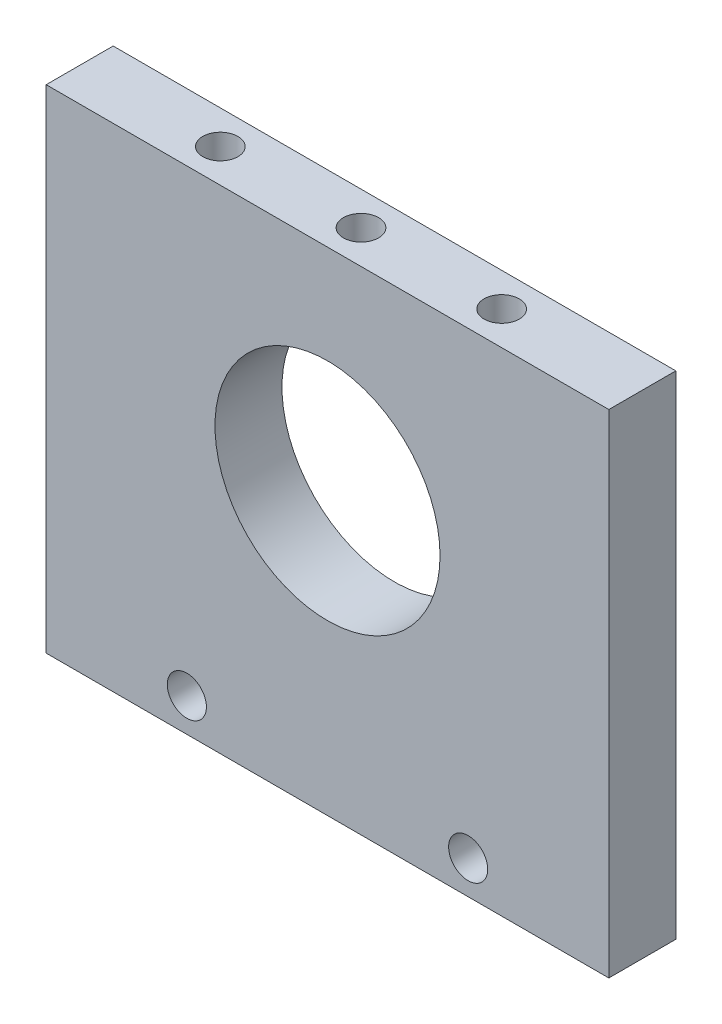
ISO-10303-21;
HEADER;
FILE_DESCRIPTION(('STEP AP214'),'2;1');
FILE_NAME('part.step','',(''),(''),'','','');
FILE_SCHEMA(('AUTOMOTIVE_DESIGN { 1 0 10303 214 1 1 1 1 }'));
ENDSEC;
DATA;
#1=APPLICATION_CONTEXT('core data for automotive mechanical design processes');
#2=APPLICATION_PROTOCOL_DEFINITION('international standard','automotive_design',2000,#1);
#3=PRODUCT_CONTEXT('',#1,'mechanical');
#4=PRODUCT('Part','Part','',(#3));
#5=PRODUCT_RELATED_PRODUCT_CATEGORY('part','',(#4));
#6=PRODUCT_DEFINITION_FORMATION('','',#4);
#7=PRODUCT_DEFINITION_CONTEXT('part definition',#1,'design');
#8=PRODUCT_DEFINITION('design','',#6,#7);
#9=PRODUCT_DEFINITION_SHAPE('','',#8);
#10=(LENGTH_UNIT() NAMED_UNIT(*) SI_UNIT(.MILLI.,.METRE.));
#11=(NAMED_UNIT(*) PLANE_ANGLE_UNIT() SI_UNIT($,.RADIAN.));
#12=(NAMED_UNIT(*) SI_UNIT($,.STERADIAN.) SOLID_ANGLE_UNIT());
#13=UNCERTAINTY_MEASURE_WITH_UNIT(LENGTH_MEASURE(1.E-05),#10,'distance_accuracy_value','');
#14=(GEOMETRIC_REPRESENTATION_CONTEXT(3) GLOBAL_UNCERTAINTY_ASSIGNED_CONTEXT((#13)) GLOBAL_UNIT_ASSIGNED_CONTEXT((#10,
#11,#12)) REPRESENTATION_CONTEXT('',''));
#15=CARTESIAN_POINT('',(0.,0.,0.));
#16=DIRECTION('',(0.,0.,1.));
#17=DIRECTION('',(1.,0.,0.));
#18=AXIS2_PLACEMENT_3D('',#15,#16,#17);
#19=CARTESIAN_POINT('',(-40.,35.,9.525));
#20=DIRECTION('',(1.,0.,0.));
#21=DIRECTION('',(0.,1.,0.));
#22=AXIS2_PLACEMENT_3D('',#19,#20,#21);
#23=PLANE('',#22);
#24=DIRECTION('',(0.,-1.,0.));
#25=VECTOR('',#24,1.);
#26=CARTESIAN_POINT('',(-40.,35.,0.));
#27=LINE('',#26,#25);
#28=CARTESIAN_POINT('',(-40.,35.,0.));
#29=VERTEX_POINT('',#28);
#30=CARTESIAN_POINT('',(-40.0000000000001,-35.,0.));
#31=VERTEX_POINT('',#30);
#32=EDGE_CURVE('E102',#29,#31,#27,.T.);
#33=ORIENTED_EDGE('',*,*,#32,.T.);
#34=DIRECTION('',(0.,0.,-1.));
#35=VECTOR('',#34,1.);
#36=CARTESIAN_POINT('',(-40.0000000000001,-35.,9.525));
#37=LINE('',#36,#35);
#38=CARTESIAN_POINT('',(-40.0000000000001,-35.,9.525));
#39=VERTEX_POINT('',#38);
#40=EDGE_CURVE('E11',#39,#31,#37,.T.);
#41=ORIENTED_EDGE('',*,*,#40,.F.);
#42=DIRECTION('',(0.,-1.,0.));
#43=VECTOR('',#42,1.);
#44=CARTESIAN_POINT('',(-40.,35.,9.525));
#45=LINE('',#44,#43);
#46=CARTESIAN_POINT('',(-40.,35.,9.525));
#47=VERTEX_POINT('',#46);
#48=EDGE_CURVE('E89',#47,#39,#45,.T.);
#49=ORIENTED_EDGE('',*,*,#48,.F.);
#50=DIRECTION('',(0.,0.,-1.));
#51=VECTOR('',#50,1.);
#52=CARTESIAN_POINT('',(-40.,35.,9.525));
#53=LINE('',#52,#51);
#54=EDGE_CURVE('E98',#47,#29,#53,.T.);
#55=ORIENTED_EDGE('',*,*,#54,.T.);
#56=EDGE_LOOP('',(#33,#41,#49,#55));
#57=FACE_BOUND('',#56,.T.);
#58=ADVANCED_FACE('F32',(#57),#23,.F.);
#59=CARTESIAN_POINT('',(-40.0000000000001,-35.,9.525));
#60=DIRECTION('',(0.,1.,0.));
#61=DIRECTION('',(-1.,0.,0.));
#62=AXIS2_PLACEMENT_3D('',#59,#60,#61);
#63=PLANE('',#62);
#64=DIRECTION('',(1.,0.,0.));
#65=VECTOR('',#64,1.);
#66=CARTESIAN_POINT('',(-40.0000000000001,-35.,0.));
#67=LINE('',#66,#65);
#68=CARTESIAN_POINT('',(40.,-35.,0.));
#69=VERTEX_POINT('',#68);
#70=EDGE_CURVE('E93',#31,#69,#67,.T.);
#71=ORIENTED_EDGE('',*,*,#70,.T.);
#72=DIRECTION('',(0.,0.,-1.));
#73=VECTOR('',#72,1.);
#74=CARTESIAN_POINT('',(40.,-35.,9.525));
#75=LINE('',#74,#73);
#76=CARTESIAN_POINT('',(40.,-35.,9.525));
#77=VERTEX_POINT('',#76);
#78=EDGE_CURVE('E45',#77,#69,#75,.T.);
#79=ORIENTED_EDGE('',*,*,#78,.F.);
#80=DIRECTION('',(1.,0.,0.));
#81=VECTOR('',#80,1.);
#82=CARTESIAN_POINT('',(-40.0000000000001,-35.,9.525));
#83=LINE('',#82,#81);
#84=EDGE_CURVE('E84',#39,#77,#83,.T.);
#85=ORIENTED_EDGE('',*,*,#84,.F.);
#86=ORIENTED_EDGE('',*,*,#40,.T.);
#87=EDGE_LOOP('',(#71,#79,#85,#86));
#88=FACE_BOUND('',#87,.T.);
#89=ADVANCED_FACE('F92',(#88),#63,.F.);
#90=CARTESIAN_POINT('',(40.,-35.,9.525));
#91=DIRECTION('',(-1.,0.,0.));
#92=DIRECTION('',(0.,-1.,0.));
#93=AXIS2_PLACEMENT_3D('',#90,#91,#92);
#94=PLANE('',#93);
#95=DIRECTION('',(0.,1.,0.));
#96=VECTOR('',#95,1.);
#97=CARTESIAN_POINT('',(40.,-35.,0.));
#98=LINE('',#97,#96);
#99=CARTESIAN_POINT('',(40.,35.,0.));
#100=VERTEX_POINT('',#99);
#101=EDGE_CURVE('E71',#69,#100,#98,.T.);
#102=ORIENTED_EDGE('',*,*,#101,.T.);
#103=DIRECTION('',(0.,0.,-1.));
#104=VECTOR('',#103,1.);
#105=CARTESIAN_POINT('',(40.,35.,9.525));
#106=LINE('',#105,#104);
#107=CARTESIAN_POINT('',(40.,35.,9.525));
#108=VERTEX_POINT('',#107);
#109=EDGE_CURVE('E94',#108,#100,#106,.T.);
#110=ORIENTED_EDGE('',*,*,#109,.F.);
#111=DIRECTION('',(0.,1.,0.));
#112=VECTOR('',#111,1.);
#113=CARTESIAN_POINT('',(40.,-35.,9.525));
#114=LINE('',#113,#112);
#115=EDGE_CURVE('E87',#77,#108,#114,.T.);
#116=ORIENTED_EDGE('',*,*,#115,.F.);
#117=ORIENTED_EDGE('',*,*,#78,.T.);
#118=EDGE_LOOP('',(#102,#110,#116,#117));
#119=FACE_BOUND('',#118,.T.);
#120=ADVANCED_FACE('F96',(#119),#94,.F.);
#121=CARTESIAN_POINT('',(40.,35.,9.525));
#122=DIRECTION('',(0.,-1.,0.));
#123=DIRECTION('',(1.,0.,0.));
#124=AXIS2_PLACEMENT_3D('',#121,#122,#123);
#125=PLANE('',#124);
#126=CARTESIAN_POINT('',(-20.,35.,4.76250000000002));
#127=DIRECTION('',(0.,1.,0.));
#128=DIRECTION('',(-1.,0.,0.));
#129=AXIS2_PLACEMENT_3D('',#126,#127,#128);
#130=CIRCLE('',#129,2.5);
#131=CARTESIAN_POINT('',(-22.5,35.,4.76250000000002));
#132=VERTEX_POINT('',#131);
#133=EDGE_CURVE('E129',#132,#132,#130,.T.);
#134=ORIENTED_EDGE('',*,*,#133,.F.);
#135=EDGE_LOOP('',(#134));
#136=FACE_BOUND('',#135,.T.);
#137=CARTESIAN_POINT('',(0.,35.,4.76250000000001));
#138=DIRECTION('',(0.,1.,0.));
#139=DIRECTION('',(-1.,0.,0.));
#140=AXIS2_PLACEMENT_3D('',#137,#138,#139);
#141=CIRCLE('',#140,2.5);
#142=CARTESIAN_POINT('',(-2.50000000000001,35.,4.76250000000001));
#143=VERTEX_POINT('',#142);
#144=EDGE_CURVE('E125',#143,#143,#141,.T.);
#145=ORIENTED_EDGE('',*,*,#144,.F.);
#146=EDGE_LOOP('',(#145));
#147=FACE_BOUND('',#146,.T.);
#148=CARTESIAN_POINT('',(20.,35.,4.76250000000002));
#149=DIRECTION('',(0.,1.,0.));
#150=DIRECTION('',(-1.,0.,0.));
#151=AXIS2_PLACEMENT_3D('',#148,#149,#150);
#152=CIRCLE('',#151,2.5);
#153=CARTESIAN_POINT('',(17.5,35.,4.76250000000002));
#154=VERTEX_POINT('',#153);
#155=EDGE_CURVE('E120',#154,#154,#152,.T.);
#156=ORIENTED_EDGE('',*,*,#155,.F.);
#157=EDGE_LOOP('',(#156));
#158=FACE_BOUND('',#157,.T.);
#159=DIRECTION('',(-1.,0.,0.));
#160=VECTOR('',#159,1.);
#161=CARTESIAN_POINT('',(40.,35.,0.));
#162=LINE('',#161,#160);
#163=EDGE_CURVE('E77',#100,#29,#162,.T.);
#164=ORIENTED_EDGE('',*,*,#163,.T.);
#165=ORIENTED_EDGE('',*,*,#54,.F.);
#166=DIRECTION('',(-1.,0.,0.));
#167=VECTOR('',#166,1.);
#168=CARTESIAN_POINT('',(40.,35.,9.525));
#169=LINE('',#168,#167);
#170=EDGE_CURVE('E54',#108,#47,#169,.T.);
#171=ORIENTED_EDGE('',*,*,#170,.F.);
#172=ORIENTED_EDGE('',*,*,#109,.T.);
#173=EDGE_LOOP('',(#164,#165,#171,#172));
#174=FACE_BOUND('',#173,.T.);
#175=ADVANCED_FACE('F152',(#136,#147,#158,#174),#125,.F.);
#176=CARTESIAN_POINT('',(-40.0000000000001,-35.,9.525));
#177=DIRECTION('',(0.,0.,1.));
#178=DIRECTION('',(1.,0.,0.));
#179=AXIS2_PLACEMENT_3D('',#176,#177,#178);
#180=PLANE('',#179);
#181=CARTESIAN_POINT('',(20.,-30.24,9.525));
#182=DIRECTION('',(0.,0.,1.));
#183=DIRECTION('',(-1.,0.,0.));
#184=AXIS2_PLACEMENT_3D('',#181,#182,#183);
#185=CIRCLE('',#184,2.78);
#186=CARTESIAN_POINT('',(22.78,-30.24,9.525));
#187=VERTEX_POINT('',#186);
#188=EDGE_CURVE('E143',#187,#187,#185,.T.);
#189=ORIENTED_EDGE('',*,*,#188,.F.);
#190=EDGE_LOOP('',(#189));
#191=FACE_BOUND('',#190,.T.);
#192=CARTESIAN_POINT('',(-20.,-30.24,9.525));
#193=DIRECTION('',(0.,0.,1.));
#194=DIRECTION('',(1.,0.,0.));
#195=AXIS2_PLACEMENT_3D('',#192,#193,#194);
#196=CIRCLE('',#195,2.78);
#197=CARTESIAN_POINT('',(-17.22,-30.24,9.525));
#198=VERTEX_POINT('',#197);
#199=EDGE_CURVE('E137',#198,#198,#196,.T.);
#200=ORIENTED_EDGE('',*,*,#199,.F.);
#201=EDGE_LOOP('',(#200));
#202=FACE_BOUND('',#201,.T.);
#203=CARTESIAN_POINT('',(0.,4.99999999999999,9.525));
#204=DIRECTION('',(0.,0.,1.));
#205=DIRECTION('',(1.,0.,0.));
#206=AXIS2_PLACEMENT_3D('',#203,#204,#205);
#207=CIRCLE('',#206,16.);
#208=CARTESIAN_POINT('',(16.,4.99999999999999,9.525));
#209=VERTEX_POINT('',#208);
#210=EDGE_CURVE('E111',#209,#209,#207,.T.);
#211=ORIENTED_EDGE('',*,*,#210,.F.);
#212=EDGE_LOOP('',(#211));
#213=FACE_BOUND('',#212,.T.);
#214=ORIENTED_EDGE('',*,*,#48,.T.);
#215=ORIENTED_EDGE('',*,*,#84,.T.);
#216=ORIENTED_EDGE('',*,*,#115,.T.);
#217=ORIENTED_EDGE('',*,*,#170,.T.);
#218=EDGE_LOOP('',(#214,#215,#216,#217));
#219=FACE_BOUND('',#218,.T.);
#220=ADVANCED_FACE('F85',(#191,#202,#213,#219),#180,.T.);
#221=CARTESIAN_POINT('',(-40.0000000000001,-35.,0.));
#222=DIRECTION('',(0.,0.,1.));
#223=DIRECTION('',(1.,0.,0.));
#224=AXIS2_PLACEMENT_3D('',#221,#222,#223);
#225=PLANE('',#224);
#226=CARTESIAN_POINT('',(20.,-30.24,0.));
#227=DIRECTION('',(0.,0.,1.));
#228=DIRECTION('',(1.,0.,0.));
#229=AXIS2_PLACEMENT_3D('',#226,#227,#228);
#230=CIRCLE('',#229,2.78);
#231=CARTESIAN_POINT('',(22.78,-30.24,0.));
#232=VERTEX_POINT('',#231);
#233=EDGE_CURVE('E140',#232,#232,#230,.F.);
#234=ORIENTED_EDGE('',*,*,#233,.F.);
#235=EDGE_LOOP('',(#234));
#236=FACE_BOUND('',#235,.T.);
#237=CARTESIAN_POINT('',(-20.,-30.24,0.));
#238=DIRECTION('',(0.,0.,1.));
#239=DIRECTION('',(1.,0.,0.));
#240=AXIS2_PLACEMENT_3D('',#237,#238,#239);
#241=CIRCLE('',#240,2.78);
#242=CARTESIAN_POINT('',(-17.22,-30.24,0.));
#243=VERTEX_POINT('',#242);
#244=EDGE_CURVE('E132',#243,#243,#241,.F.);
#245=ORIENTED_EDGE('',*,*,#244,.F.);
#246=EDGE_LOOP('',(#245));
#247=FACE_BOUND('',#246,.T.);
#248=CARTESIAN_POINT('',(0.,4.99999999999999,0.));
#249=DIRECTION('',(0.,0.,1.));
#250=DIRECTION('',(1.,0.,0.));
#251=AXIS2_PLACEMENT_3D('',#248,#249,#250);
#252=CIRCLE('',#251,16.);
#253=CARTESIAN_POINT('',(16.,4.99999999999999,0.));
#254=VERTEX_POINT('',#253);
#255=EDGE_CURVE('E105',#254,#254,#252,.T.);
#256=ORIENTED_EDGE('',*,*,#255,.T.);
#257=EDGE_LOOP('',(#256));
#258=FACE_BOUND('',#257,.T.);
#259=ORIENTED_EDGE('',*,*,#32,.F.);
#260=ORIENTED_EDGE('',*,*,#163,.F.);
#261=ORIENTED_EDGE('',*,*,#101,.F.);
#262=ORIENTED_EDGE('',*,*,#70,.F.);
#263=EDGE_LOOP('',(#259,#260,#261,#262));
#264=FACE_BOUND('',#263,.T.);
#265=ADVANCED_FACE('F151',(#236,#247,#258,#264),#225,.F.);
#266=CARTESIAN_POINT('',(0.,4.99999999999999,-0.475));
#267=DIRECTION('',(0.,0.,1.));
#268=DIRECTION('',(1.,0.,0.));
#269=AXIS2_PLACEMENT_3D('',#266,#267,#268);
#270=CYLINDRICAL_SURFACE('',#269,16.);
#271=CARTESIAN_POINT('',(-2.5,20.8034806292791,4.76250000000001));
#272=CARTESIAN_POINT('',(-2.49999429179104,20.8034830346332,4.90200337834099));
#273=CARTESIAN_POINT('',(-2.48828377742084,20.8053478026579,5.04158599768532));
#274=CARTESIAN_POINT('',(-2.44176643645043,20.8125997089632,5.31684362900286));
#275=CARTESIAN_POINT('',(-2.40693752801736,20.8179902148259,5.45251477547937));
#276=CARTESIAN_POINT('',(-2.31525516047133,20.8316684916183,5.7159255896444));
#277=CARTESIAN_POINT('',(-2.25841914921922,20.8399539668268,5.84367144787077));
#278=CARTESIAN_POINT('',(-2.12437791816389,20.8584858981598,6.08779689084213));
#279=CARTESIAN_POINT('',(-2.04717531605122,20.8687321022281,6.20417793365955));
#280=CARTESIAN_POINT('',(-1.87387730110911,20.8901303851737,6.42329648515128));
#281=CARTESIAN_POINT('',(-1.777639886175,20.9012888784461,6.52592107439965));
#282=CARTESIAN_POINT('',(-1.56931080987672,20.9231973082665,6.71363422042994));
#283=CARTESIAN_POINT('',(-1.45721825316849,20.9339472216983,6.7987217862243));
#284=CARTESIAN_POINT('',(-1.21963429185761,20.9538946715316,6.94936487704116));
#285=CARTESIAN_POINT('',(-1.09407592635729,20.9630838016344,7.01481600397447));
#286=CARTESIAN_POINT('',(-0.833580171794758,20.978803149105,7.12365795472509));
#287=CARTESIAN_POINT('',(-0.698643320136812,20.9853335186778,7.16705004138268));
#288=CARTESIAN_POINT('',(-0.424385325448813,20.9949542857973,7.23019871895617));
#289=CARTESIAN_POINT('',(-0.285108760160753,20.9980722260505,7.25014464906836));
#290=CARTESIAN_POINT('',(-0.00515314355067215,21.0006113098095,7.26642304330338));
#291=CARTESIAN_POINT('',(0.135525822989186,21.0000326754547,7.26275692635186));
#292=CARTESIAN_POINT('',(0.41300008972215,20.9952657389868,7.23206407372215));
#293=CARTESIAN_POINT('',(0.549818542575173,20.9911089169598,7.20524106115969));
#294=CARTESIAN_POINT('',(0.81698837534349,20.9796877395528,7.12931597137739));
#295=CARTESIAN_POINT('',(0.947339577352173,20.9724232987387,7.08021328164587));
#296=CARTESIAN_POINT('',(1.19848742679247,20.9555491842028,6.96091634413996));
#297=CARTESIAN_POINT('',(1.31924299071837,20.9459300777042,6.89063699457206));
#298=CARTESIAN_POINT('',(1.54732385653213,20.9254174702046,6.73104391937077));
#299=CARTESIAN_POINT('',(1.65464819959324,20.9145238783282,6.64172883604502));
#300=CARTESIAN_POINT('',(1.85402198520023,20.8925387825556,6.44546651292675));
#301=CARTESIAN_POINT('',(1.94589625613074,20.8814464071021,6.33834133360515));
#302=CARTESIAN_POINT('',(2.11039226047485,20.8604269384474,6.11010243531788));
#303=CARTESIAN_POINT('',(2.18301385538335,20.8504998536298,5.98898861572595));
#304=CARTESIAN_POINT('',(2.30697060635685,20.8329349281613,5.73602037189421));
#305=CARTESIAN_POINT('',(2.3582866388416,20.8252991458489,5.60415642492656));
#306=CARTESIAN_POINT('',(2.43799343127668,20.8132168990948,5.33353515129453));
#307=CARTESIAN_POINT('',(2.46638595195257,20.8087701897074,5.19477835493029));
#308=CARTESIAN_POINT('',(2.49919719237856,20.8036163696886,4.9158718967248));
#309=CARTESIAN_POINT('',(2.50386473411271,20.80287044806,4.77575219980525));
#310=CARTESIAN_POINT('',(2.48975479033184,20.8050994977182,4.4967323647021));
#311=CARTESIAN_POINT('',(2.47097809654328,20.8080743433524,4.35783218549415));
#312=CARTESIAN_POINT('',(2.41072412555895,20.8173740105186,4.08597219253354));
#313=CARTESIAN_POINT('',(2.36937178781979,20.8236803883335,3.95298400136041));
#314=CARTESIAN_POINT('',(2.26527072241931,20.8389172439685,3.69582602889612));
#315=CARTESIAN_POINT('',(2.20252085602949,20.8478478614411,3.57165671735099));
#316=CARTESIAN_POINT('',(2.05681199170293,20.8674179220711,3.33454871835119));
#317=CARTESIAN_POINT('',(1.97369251093471,20.8780706945976,3.22170977110004));
#318=CARTESIAN_POINT('',(1.78982593995282,20.8998450469621,3.0114930191518));
#319=CARTESIAN_POINT('',(1.6890777652142,20.910966655611,2.91411616639297));
#320=CARTESIAN_POINT('',(1.47171546765808,20.9325473887455,2.73668872936454));
#321=CARTESIAN_POINT('',(1.35496564158983,20.9429995842164,2.65680342356994));
#322=CARTESIAN_POINT('',(1.10955861029337,20.9619548934084,2.51778048000977));
#323=CARTESIAN_POINT('',(0.980901753162486,20.9704580640831,2.45864223595407));
#324=CARTESIAN_POINT('',(0.71583966377832,20.9845269767683,2.36305372471586));
#325=CARTESIAN_POINT('',(0.579467147617082,20.9901042225572,2.3265145025606));
#326=CARTESIAN_POINT('',(0.302427949770739,20.9977412978945,2.2768738673272));
#327=CARTESIAN_POINT('',(0.161761577654425,20.9998013804089,2.26377076864405));
#328=CARTESIAN_POINT('',(-0.118272165188276,21.0001691012796,2.26141814734479));
#329=CARTESIAN_POINT('',(-0.257637428859792,20.9985164403994,2.27191625535725));
#330=CARTESIAN_POINT('',(-0.532594595464888,20.9917247801431,2.31592531618036));
#331=CARTESIAN_POINT('',(-0.668186513581647,20.9865857947973,2.34943617637843));
#332=CARTESIAN_POINT('',(-0.931668850429407,20.9733964142131,2.43842725971237));
#333=CARTESIAN_POINT('',(-1.05956579651626,20.965348528289,2.49388855158094));
#334=CARTESIAN_POINT('',(-1.30427807253219,20.947223323121,2.62517883852203));
#335=CARTESIAN_POINT('',(-1.42109298145458,20.9371459268214,2.70100860697422));
#336=CARTESIAN_POINT('',(-1.64160219185804,20.9159528222148,2.87178944320839));
#337=CARTESIAN_POINT('',(-1.745151694824,20.9048276353277,2.96692631430404));
#338=CARTESIAN_POINT('',(-1.93490712736948,20.8828612878644,3.17322995733541));
#339=CARTESIAN_POINT('',(-2.02110898563013,20.8720201944801,3.28440048172471));
#340=CARTESIAN_POINT('',(-2.17420151541622,20.8517779742959,3.5204211042754));
#341=CARTESIAN_POINT('',(-2.24097044145097,20.842386091806,3.64535095860972));
#342=CARTESIAN_POINT('',(-2.35247565604315,20.8262143333515,3.90474321763004));
#343=CARTESIAN_POINT('',(-2.3972345005847,20.8194317848938,4.03919570111659));
#344=CARTESIAN_POINT('',(-2.45344906957714,20.8107909670081,4.27226973969641));
#345=CARTESIAN_POINT('',(-2.47087849275467,20.8080643798014,4.36946159998489));
#346=CARTESIAN_POINT('',(-2.49415589078729,20.804408373768,4.56525578104638));
#347=CARTESIAN_POINT('',(-2.50000403623692,20.803478928469,4.66385808102177));
#348=CARTESIAN_POINT('',(-2.5,20.8034806292791,4.76250000000001));
#349=B_SPLINE_CURVE_WITH_KNOTS('',3,(#271,#272,#273,#274,#275,#276,#277,#278,#279,#280,#281,
#282,#283,#284,#285,#286,#287,#288,#289,#290,#291,#292,#293,#294,#295,#296,#297,#298,#299,#300,
#301,#302,#303,#304,#305,#306,#307,#308,#309,#310,#311,#312,#313,#314,#315,#316,#317,#318,#319,
#320,#321,#322,#323,#324,#325,#326,#327,#328,#329,#330,#331,#332,#333,#334,#335,#336,#337,#338,
#339,#340,#341,#342,#343,#344,#345,#346,#347,#348),.UNSPECIFIED.,.T.,.F.,(4,2,2,2,2,2,2,2,2,2,2,
2,2,2,2,2,2,2,2,2,2,2,2,2,2,2,2,2,2,2,2,2,2,2,2,2,2,2,4),(0.,0.41814952790224,0.836699032574078,
1.25491737645053,1.67308199345223,2.09449258051085,2.51592697424482,2.93956378022295,
3.36317633102574,3.78334397517517,4.20348637030326,4.61996979150785,5.03646466334576,
5.45465612930833,5.87287743207563,6.29556043395287,6.71824647655855,7.14131110038651,
7.56434322607052,7.98292940034458,8.40150143908464,8.81778013452042,9.23408098683359,
9.65377352836981,10.0734918986585,10.4970197199928,10.9205351635679,11.3423727623224,
11.7641800198745,12.18149834073,12.5988149821383,13.0157724881518,13.432745828047,
13.8539404040181,14.275233715164,14.6991122166338,15.1225554163993,15.4182305458031,
15.7139013198206),.UNSPECIFIED.);
#350=CARTESIAN_POINT('',(-2.5,20.8034806292791,4.76250000000001));
#351=VERTEX_POINT('',#350);
#352=EDGE_CURVE('E35',#351,#351,#349,.T.);
#353=ORIENTED_EDGE('',*,*,#352,.T.);
#354=EDGE_LOOP('',(#353));
#355=FACE_BOUND('',#354,.T.);
#356=ORIENTED_EDGE('',*,*,#210,.T.);
#357=EDGE_LOOP('',(#356));
#358=FACE_BOUND('',#357,.T.);
#359=ORIENTED_EDGE('',*,*,#255,.F.);
#360=EDGE_LOOP('',(#359));
#361=FACE_BOUND('',#360,.T.);
#362=ADVANCED_FACE('F179',(#355,#358,#361),#270,.F.);
#363=CARTESIAN_POINT('',(20.,12.,4.76250000000002));
#364=DIRECTION('',(0.,1.,0.));
#365=DIRECTION('',(-1.,0.,0.));
#366=AXIS2_PLACEMENT_3D('',#363,#364,#365);
#367=CYLINDRICAL_SURFACE('',#366,2.5);
#368=CARTESIAN_POINT('',(20.,12.,4.76250000000002));
#369=DIRECTION('',(0.,1.,0.));
#370=DIRECTION('',(-1.,0.,0.));
#371=AXIS2_PLACEMENT_3D('',#368,#369,#370);
#372=CIRCLE('',#371,2.5);
#373=CARTESIAN_POINT('',(17.5,12.,4.76250000000002));
#374=VERTEX_POINT('',#373);
#375=EDGE_CURVE('E115',#374,#374,#372,.T.);
#376=ORIENTED_EDGE('',*,*,#375,.F.);
#377=EDGE_LOOP('',(#376));
#378=FACE_BOUND('',#377,.T.);
#379=ORIENTED_EDGE('',*,*,#155,.T.);
#380=EDGE_LOOP('',(#379));
#381=FACE_BOUND('',#380,.T.);
#382=ADVANCED_FACE('F185',(#378,#381),#367,.F.);
#383=CARTESIAN_POINT('',(20.,12.,4.76250000000002));
#384=DIRECTION('',(0.,1.,0.));
#385=DIRECTION('',(-1.,0.,0.));
#386=AXIS2_PLACEMENT_3D('',#383,#384,#385);
#387=PLANE('',#386);
#388=ORIENTED_EDGE('',*,*,#375,.T.);
#389=EDGE_LOOP('',(#388));
#390=FACE_BOUND('',#389,.T.);
#391=ADVANCED_FACE('F246',(#390),#387,.T.);
#392=CARTESIAN_POINT('',(0.,12.,4.76250000000001));
#393=DIRECTION('',(0.,1.,0.));
#394=DIRECTION('',(-1.,0.,0.));
#395=AXIS2_PLACEMENT_3D('',#392,#393,#394);
#396=CYLINDRICAL_SURFACE('',#395,2.5);
#397=ORIENTED_EDGE('',*,*,#144,.T.);
#398=EDGE_LOOP('',(#397));
#399=FACE_BOUND('',#398,.T.);
#400=ORIENTED_EDGE('',*,*,#352,.F.);
#401=EDGE_LOOP('',(#400));
#402=FACE_BOUND('',#401,.T.);
#403=ADVANCED_FACE('F237',(#399,#402),#396,.F.);
#404=CARTESIAN_POINT('',(-20.,12.,4.76250000000002));
#405=DIRECTION('',(0.,1.,0.));
#406=DIRECTION('',(-1.,0.,0.));
#407=AXIS2_PLACEMENT_3D('',#404,#405,#406);
#408=CYLINDRICAL_SURFACE('',#407,2.5);
#409=CARTESIAN_POINT('',(-20.,12.,4.76250000000002));
#410=DIRECTION('',(0.,1.,0.));
#411=DIRECTION('',(-1.,0.,0.));
#412=AXIS2_PLACEMENT_3D('',#409,#410,#411);
#413=CIRCLE('',#412,2.5);
#414=CARTESIAN_POINT('',(-22.5,12.,4.76250000000002));
#415=VERTEX_POINT('',#414);
#416=EDGE_CURVE('E128',#415,#415,#413,.T.);
#417=ORIENTED_EDGE('',*,*,#416,.F.);
#418=EDGE_LOOP('',(#417));
#419=FACE_BOUND('',#418,.T.);
#420=ORIENTED_EDGE('',*,*,#133,.T.);
#421=EDGE_LOOP('',(#420));
#422=FACE_BOUND('',#421,.T.);
#423=ADVANCED_FACE('F168',(#419,#422),#408,.F.);
#424=CARTESIAN_POINT('',(-20.,12.,4.76250000000002));
#425=DIRECTION('',(0.,1.,0.));
#426=DIRECTION('',(-1.,0.,0.));
#427=AXIS2_PLACEMENT_3D('',#424,#425,#426);
#428=PLANE('',#427);
#429=ORIENTED_EDGE('',*,*,#416,.T.);
#430=EDGE_LOOP('',(#429));
#431=FACE_BOUND('',#430,.T.);
#432=ADVANCED_FACE('F159',(#431),#428,.T.);
#433=CARTESIAN_POINT('',(-20.,-30.24,-7.86302740679441));
#434=DIRECTION('',(0.,0.,1.));
#435=DIRECTION('',(1.,0.,0.));
#436=AXIS2_PLACEMENT_3D('',#433,#434,#435);
#437=CYLINDRICAL_SURFACE('',#436,2.78);
#438=CARTESIAN_POINT('',(-17.22,-30.24,0.));
#439=CARTESIAN_POINT('',(-17.22,-30.24,0.0992187500000001));
#440=CARTESIAN_POINT('',(-17.22,-30.24,0.1984375));
#441=CARTESIAN_POINT('',(-17.22,-30.24,0.396875));
#442=CARTESIAN_POINT('',(-17.22,-30.24,0.49609375));
#443=CARTESIAN_POINT('',(-17.22,-30.24,0.69453125));
#444=CARTESIAN_POINT('',(-17.22,-30.24,0.79375));
#445=CARTESIAN_POINT('',(-17.22,-30.24,0.992187500000001));
#446=CARTESIAN_POINT('',(-17.22,-30.24,1.09140625));
#447=CARTESIAN_POINT('',(-17.22,-30.24,1.28984375));
#448=CARTESIAN_POINT('',(-17.22,-30.24,1.3890625));
#449=CARTESIAN_POINT('',(-17.22,-30.24,1.5875));
#450=CARTESIAN_POINT('',(-17.22,-30.24,1.68671875));
#451=CARTESIAN_POINT('',(-17.22,-30.24,1.88515625));
#452=CARTESIAN_POINT('',(-17.22,-30.24,1.984375));
#453=CARTESIAN_POINT('',(-17.22,-30.24,2.1828125));
#454=CARTESIAN_POINT('',(-17.22,-30.24,2.28203125));
#455=CARTESIAN_POINT('',(-17.22,-30.24,2.48046875));
#456=CARTESIAN_POINT('',(-17.22,-30.24,2.5796875));
#457=CARTESIAN_POINT('',(-17.22,-30.24,2.778125));
#458=CARTESIAN_POINT('',(-17.22,-30.24,2.87734375));
#459=CARTESIAN_POINT('',(-17.22,-30.24,3.07578125));
#460=CARTESIAN_POINT('',(-17.22,-30.24,3.175));
#461=CARTESIAN_POINT('',(-17.22,-30.24,3.3734375));
#462=CARTESIAN_POINT('',(-17.22,-30.24,3.47265625));
#463=CARTESIAN_POINT('',(-17.22,-30.24,3.67109375));
#464=CARTESIAN_POINT('',(-17.22,-30.24,3.7703125));
#465=CARTESIAN_POINT('',(-17.22,-30.24,3.96875));
#466=CARTESIAN_POINT('',(-17.22,-30.24,4.06796875));
#467=CARTESIAN_POINT('',(-17.22,-30.24,4.26640625));
#468=CARTESIAN_POINT('',(-17.22,-30.24,4.365625));
#469=CARTESIAN_POINT('',(-17.22,-30.24,4.5640625));
#470=CARTESIAN_POINT('',(-17.22,-30.24,4.66328125));
#471=CARTESIAN_POINT('',(-17.22,-30.24,4.86171875));
#472=CARTESIAN_POINT('',(-17.22,-30.24,4.9609375));
#473=CARTESIAN_POINT('',(-17.22,-30.24,5.159375));
#474=CARTESIAN_POINT('',(-17.22,-30.24,5.25859375));
#475=CARTESIAN_POINT('',(-17.22,-30.24,5.45703125));
#476=CARTESIAN_POINT('',(-17.22,-30.24,5.55625));
#477=CARTESIAN_POINT('',(-17.22,-30.24,5.7546875));
#478=CARTESIAN_POINT('',(-17.22,-30.24,5.85390625));
#479=CARTESIAN_POINT('',(-17.22,-30.24,6.05234375));
#480=CARTESIAN_POINT('',(-17.22,-30.24,6.1515625));
#481=CARTESIAN_POINT('',(-17.22,-30.24,6.35));
#482=CARTESIAN_POINT('',(-17.22,-30.24,6.44921875));
#483=CARTESIAN_POINT('',(-17.22,-30.24,6.64765625));
#484=CARTESIAN_POINT('',(-17.22,-30.24,6.746875));
#485=CARTESIAN_POINT('',(-17.22,-30.24,6.9453125));
#486=CARTESIAN_POINT('',(-17.22,-30.24,7.04453125));
#487=CARTESIAN_POINT('',(-17.22,-30.24,7.24296875));
#488=CARTESIAN_POINT('',(-17.22,-30.24,7.3421875));
#489=CARTESIAN_POINT('',(-17.22,-30.24,7.540625));
#490=CARTESIAN_POINT('',(-17.22,-30.24,7.63984375));
#491=CARTESIAN_POINT('',(-17.22,-30.24,7.83828125));
#492=CARTESIAN_POINT('',(-17.22,-30.24,7.9375));
#493=CARTESIAN_POINT('',(-17.22,-30.24,8.1359375));
#494=CARTESIAN_POINT('',(-17.22,-30.24,8.23515625));
#495=CARTESIAN_POINT('',(-17.22,-30.24,8.43359375));
#496=CARTESIAN_POINT('',(-17.22,-30.24,8.5328125));
#497=CARTESIAN_POINT('',(-17.22,-30.24,8.73125));
#498=CARTESIAN_POINT('',(-17.22,-30.24,8.83046875));
#499=CARTESIAN_POINT('',(-17.22,-30.24,9.02890625));
#500=CARTESIAN_POINT('',(-17.22,-30.24,9.128125));
#501=CARTESIAN_POINT('',(-17.22,-30.24,9.3265625));
#502=CARTESIAN_POINT('',(-17.22,-30.24,9.42578125));
#503=CARTESIAN_POINT('',(-17.22,-30.24,9.525));
#504=B_SPLINE_CURVE_WITH_KNOTS('',3,(#438,#439,#440,#441,#442,#443,#444,#445,#446,#447,#448,
#449,#450,#451,#452,#453,#454,#455,#456,#457,#458,#459,#460,#461,#462,#463,#464,#465,#466,#467,
#468,#469,#470,#471,#472,#473,#474,#475,#476,#477,#478,#479,#480,#481,#482,#483,#484,#485,#486,
#487,#488,#489,#490,#491,#492,#493,#494,#495,#496,#497,#498,#499,#500,#501,#502,#503),
.UNSPECIFIED.,.F.,.F.,(4,2,2,2,2,2,2,2,2,2,2,2,2,2,2,2,2,2,2,2,2,2,2,2,2,2,2,2,2,2,2,2,4),(0.,
0.29765625,0.5953125,0.892968750000001,1.190625,1.48828125,1.7859375,2.08359375,2.38125,
2.67890625,2.9765625,3.27421875,3.571875,3.86953125,4.1671875,4.46484375,4.7625,5.06015625,
5.3578125,5.65546875,5.953125,6.25078125,6.5484375,6.84609375,7.14375,7.44140625,7.7390625,
8.03671875,8.334375,8.63203125,8.9296875,9.22734375,9.525),.UNSPECIFIED.);
#505=EDGE_CURVE('BSEAM157',#243,#198,#504,.T.);
#506=ORIENTED_EDGE('',*,*,#244,.T.);
#507=ORIENTED_EDGE('',*,*,#199,.T.);
#508=ORIENTED_EDGE('',*,*,#505,.T.);
#509=ORIENTED_EDGE('',*,*,#505,.F.);
#510=EDGE_LOOP('',(#506,#508,#507,#509));
#511=FACE_BOUND('',#510,.T.);
#512=ADVANCED_FACE('F157',(#511),#437,.F.);
#513=CARTESIAN_POINT('',(20.,-30.24,-7.86302740679441));
#514=DIRECTION('',(0.,0.,1.));
#515=DIRECTION('',(1.,0.,0.));
#516=AXIS2_PLACEMENT_3D('',#513,#514,#515);
#517=CYLINDRICAL_SURFACE('',#516,2.78);
#518=CARTESIAN_POINT('',(22.78,-30.24,0.));
#519=CARTESIAN_POINT('',(22.78,-30.24,0.0992187500000001));
#520=CARTESIAN_POINT('',(22.78,-30.24,0.1984375));
#521=CARTESIAN_POINT('',(22.78,-30.24,0.396875));
#522=CARTESIAN_POINT('',(22.78,-30.24,0.49609375));
#523=CARTESIAN_POINT('',(22.78,-30.24,0.69453125));
#524=CARTESIAN_POINT('',(22.78,-30.24,0.79375));
#525=CARTESIAN_POINT('',(22.78,-30.24,0.992187500000001));
#526=CARTESIAN_POINT('',(22.78,-30.24,1.09140625));
#527=CARTESIAN_POINT('',(22.78,-30.24,1.28984375));
#528=CARTESIAN_POINT('',(22.78,-30.24,1.3890625));
#529=CARTESIAN_POINT('',(22.78,-30.24,1.5875));
#530=CARTESIAN_POINT('',(22.78,-30.24,1.68671875));
#531=CARTESIAN_POINT('',(22.78,-30.24,1.88515625));
#532=CARTESIAN_POINT('',(22.78,-30.24,1.984375));
#533=CARTESIAN_POINT('',(22.78,-30.24,2.1828125));
#534=CARTESIAN_POINT('',(22.78,-30.24,2.28203125));
#535=CARTESIAN_POINT('',(22.78,-30.24,2.48046875));
#536=CARTESIAN_POINT('',(22.78,-30.24,2.5796875));
#537=CARTESIAN_POINT('',(22.78,-30.24,2.778125));
#538=CARTESIAN_POINT('',(22.78,-30.24,2.87734375));
#539=CARTESIAN_POINT('',(22.78,-30.24,3.07578125));
#540=CARTESIAN_POINT('',(22.78,-30.24,3.175));
#541=CARTESIAN_POINT('',(22.78,-30.24,3.3734375));
#542=CARTESIAN_POINT('',(22.78,-30.24,3.47265625));
#543=CARTESIAN_POINT('',(22.78,-30.24,3.67109375));
#544=CARTESIAN_POINT('',(22.78,-30.24,3.7703125));
#545=CARTESIAN_POINT('',(22.78,-30.24,3.96875));
#546=CARTESIAN_POINT('',(22.78,-30.24,4.06796875));
#547=CARTESIAN_POINT('',(22.78,-30.24,4.26640625));
#548=CARTESIAN_POINT('',(22.78,-30.24,4.365625));
#549=CARTESIAN_POINT('',(22.78,-30.24,4.5640625));
#550=CARTESIAN_POINT('',(22.78,-30.24,4.66328125));
#551=CARTESIAN_POINT('',(22.78,-30.24,4.86171875));
#552=CARTESIAN_POINT('',(22.78,-30.24,4.9609375));
#553=CARTESIAN_POINT('',(22.78,-30.24,5.159375));
#554=CARTESIAN_POINT('',(22.78,-30.24,5.25859375));
#555=CARTESIAN_POINT('',(22.78,-30.24,5.45703125));
#556=CARTESIAN_POINT('',(22.78,-30.24,5.55625));
#557=CARTESIAN_POINT('',(22.78,-30.24,5.7546875));
#558=CARTESIAN_POINT('',(22.78,-30.24,5.85390625));
#559=CARTESIAN_POINT('',(22.78,-30.24,6.05234375));
#560=CARTESIAN_POINT('',(22.78,-30.24,6.1515625));
#561=CARTESIAN_POINT('',(22.78,-30.24,6.35));
#562=CARTESIAN_POINT('',(22.78,-30.24,6.44921875));
#563=CARTESIAN_POINT('',(22.78,-30.24,6.64765625));
#564=CARTESIAN_POINT('',(22.78,-30.24,6.746875));
#565=CARTESIAN_POINT('',(22.78,-30.24,6.9453125));
#566=CARTESIAN_POINT('',(22.78,-30.24,7.04453125));
#567=CARTESIAN_POINT('',(22.78,-30.24,7.24296875));
#568=CARTESIAN_POINT('',(22.78,-30.24,7.3421875));
#569=CARTESIAN_POINT('',(22.78,-30.24,7.540625));
#570=CARTESIAN_POINT('',(22.78,-30.24,7.63984375));
#571=CARTESIAN_POINT('',(22.78,-30.24,7.83828125));
#572=CARTESIAN_POINT('',(22.78,-30.24,7.9375));
#573=CARTESIAN_POINT('',(22.78,-30.24,8.1359375));
#574=CARTESIAN_POINT('',(22.78,-30.24,8.23515625));
#575=CARTESIAN_POINT('',(22.78,-30.24,8.43359375));
#576=CARTESIAN_POINT('',(22.78,-30.24,8.5328125));
#577=CARTESIAN_POINT('',(22.78,-30.24,8.73125));
#578=CARTESIAN_POINT('',(22.78,-30.24,8.83046875));
#579=CARTESIAN_POINT('',(22.78,-30.24,9.02890625));
#580=CARTESIAN_POINT('',(22.78,-30.24,9.128125));
#581=CARTESIAN_POINT('',(22.78,-30.24,9.3265625));
#582=CARTESIAN_POINT('',(22.78,-30.24,9.42578125));
#583=CARTESIAN_POINT('',(22.78,-30.24,9.525));
#584=B_SPLINE_CURVE_WITH_KNOTS('',3,(#518,#519,#520,#521,#522,#523,#524,#525,#526,#527,#528,
#529,#530,#531,#532,#533,#534,#535,#536,#537,#538,#539,#540,#541,#542,#543,#544,#545,#546,#547,
#548,#549,#550,#551,#552,#553,#554,#555,#556,#557,#558,#559,#560,#561,#562,#563,#564,#565,#566,
#567,#568,#569,#570,#571,#572,#573,#574,#575,#576,#577,#578,#579,#580,#581,#582,#583),
.UNSPECIFIED.,.F.,.F.,(4,2,2,2,2,2,2,2,2,2,2,2,2,2,2,2,2,2,2,2,2,2,2,2,2,2,2,2,2,2,2,2,4),(0.,
0.29765625,0.5953125,0.892968750000001,1.190625,1.48828125,1.7859375,2.08359375,2.38125,
2.67890625,2.9765625,3.27421875,3.571875,3.86953125,4.1671875,4.46484375,4.7625,5.06015625,
5.3578125,5.65546875,5.953125,6.25078125,6.5484375,6.84609375,7.14375,7.44140625,7.7390625,
8.03671875,8.334375,8.63203125,8.9296875,9.22734375,9.525),.UNSPECIFIED.);
#585=EDGE_CURVE('BSEAM147',#232,#187,#584,.T.);
#586=ORIENTED_EDGE('',*,*,#233,.T.);
#587=ORIENTED_EDGE('',*,*,#188,.T.);
#588=ORIENTED_EDGE('',*,*,#585,.T.);
#589=ORIENTED_EDGE('',*,*,#585,.F.);
#590=EDGE_LOOP('',(#586,#588,#587,#589));
#591=FACE_BOUND('',#590,.T.);
#592=ADVANCED_FACE('F147',(#591),#517,.F.);
#593=CLOSED_SHELL('',(#58,#89,#120,#175,#220,#265,#362,#382,#391,#403,#423,#432,#512,#592));
#594=MANIFOLD_SOLID_BREP('B2',#593);
#595=ADVANCED_BREP_SHAPE_REPRESENTATION('',(#18,#594),#14);
#596=SHAPE_DEFINITION_REPRESENTATION(#9,#595);
ENDSEC;
END-ISO-10303-21;
